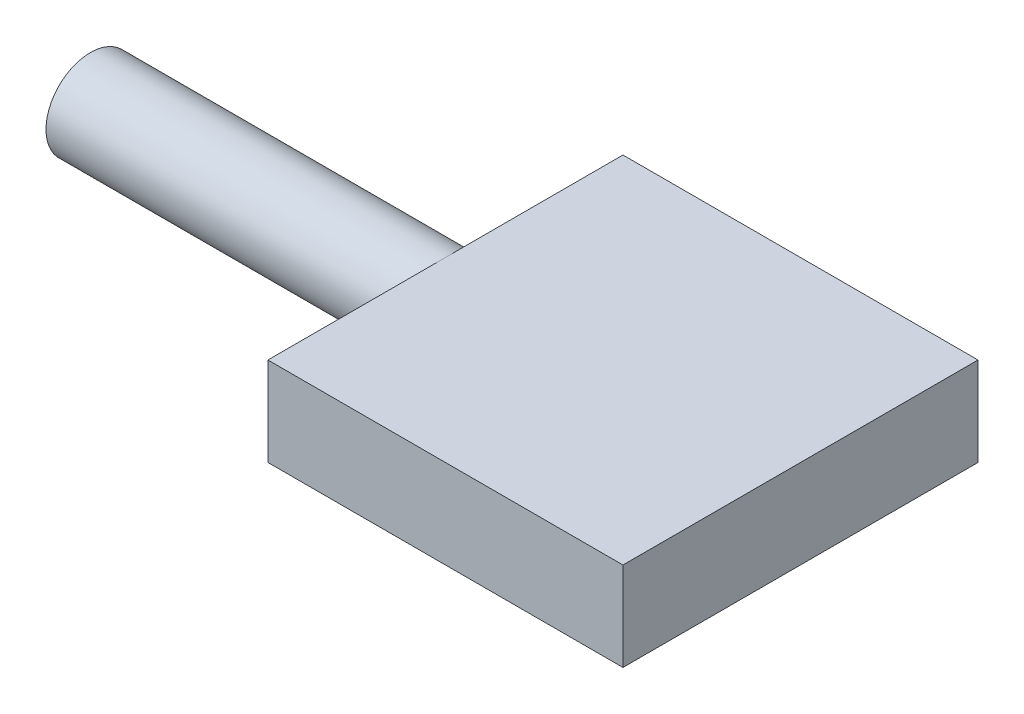
ISO-10303-21;
HEADER;
FILE_DESCRIPTION(('STEP AP214'),'2;1');
FILE_NAME('part.step','',(''),(''),'','','');
FILE_SCHEMA(('AUTOMOTIVE_DESIGN { 1 0 10303 214 1 1 1 1 }'));
ENDSEC;
DATA;
#1=APPLICATION_CONTEXT('core data for automotive mechanical design processes');
#2=APPLICATION_PROTOCOL_DEFINITION('international standard','automotive_design',2000,#1);
#3=PRODUCT_CONTEXT('',#1,'mechanical');
#4=PRODUCT('Part','Part','',(#3));
#5=PRODUCT_RELATED_PRODUCT_CATEGORY('part','',(#4));
#6=PRODUCT_DEFINITION_FORMATION('','',#4);
#7=PRODUCT_DEFINITION_CONTEXT('part definition',#1,'design');
#8=PRODUCT_DEFINITION('design','',#6,#7);
#9=PRODUCT_DEFINITION_SHAPE('','',#8);
#10=(LENGTH_UNIT() NAMED_UNIT(*) SI_UNIT(.MILLI.,.METRE.));
#11=(NAMED_UNIT(*) PLANE_ANGLE_UNIT() SI_UNIT($,.RADIAN.));
#12=(NAMED_UNIT(*) SI_UNIT($,.STERADIAN.) SOLID_ANGLE_UNIT());
#13=UNCERTAINTY_MEASURE_WITH_UNIT(LENGTH_MEASURE(1.E-05),#10,'distance_accuracy_value','');
#14=(GEOMETRIC_REPRESENTATION_CONTEXT(3) GLOBAL_UNCERTAINTY_ASSIGNED_CONTEXT((#13)) GLOBAL_UNIT_ASSIGNED_CONTEXT((#10,
#11,#12)) REPRESENTATION_CONTEXT('',''));
#15=CARTESIAN_POINT('',(0.,0.,0.));
#16=DIRECTION('',(0.,0.,1.));
#17=DIRECTION('',(1.,0.,0.));
#18=AXIS2_PLACEMENT_3D('',#15,#16,#17);
#19=CARTESIAN_POINT('',(0.,10.,0.));
#20=DIRECTION('',(1.,0.,0.));
#21=DIRECTION('',(0.,0.,-1.));
#22=AXIS2_PLACEMENT_3D('',#19,#20,#21);
#23=PLANE('',#22);
#24=CARTESIAN_POINT('',(0.,5.,-20.));
#25=DIRECTION('',(-1.,0.,0.));
#26=DIRECTION('',(0.,0.,1.));
#27=AXIS2_PLACEMENT_3D('',#24,#25,#26);
#28=CIRCLE('',#27,5.);
#29=CARTESIAN_POINT('',(0.,10.,-20.));
#30=VERTEX_POINT('',#29);
#31=CARTESIAN_POINT('',(0.,0.,-20.));
#32=VERTEX_POINT('',#31);
#33=EDGE_CURVE('E42',#30,#32,#28,.T.);
#34=ORIENTED_EDGE('',*,*,#33,.F.);
#35=DIRECTION('',(0.,0.,1.));
#36=VECTOR('',#35,1.);
#37=CARTESIAN_POINT('',(0.,10.,0.));
#38=LINE('',#37,#36);
#39=CARTESIAN_POINT('',(0.,10.,-40.));
#40=VERTEX_POINT('',#39);
#41=EDGE_CURVE('E85',#40,#30,#38,.T.);
#42=ORIENTED_EDGE('',*,*,#41,.F.);
#43=DIRECTION('',(0.,-1.,0.));
#44=VECTOR('',#43,1.);
#45=CARTESIAN_POINT('',(0.,10.,-40.));
#46=LINE('',#45,#44);
#47=CARTESIAN_POINT('',(0.,0.,-40.));
#48=VERTEX_POINT('',#47);
#49=EDGE_CURVE('E196',#40,#48,#46,.T.);
#50=ORIENTED_EDGE('',*,*,#49,.T.);
#51=DIRECTION('',(0.,0.,1.));
#52=VECTOR('',#51,1.);
#53=CARTESIAN_POINT('',(0.,0.,0.));
#54=LINE('',#53,#52);
#55=EDGE_CURVE('E96',#48,#32,#54,.T.);
#56=ORIENTED_EDGE('',*,*,#55,.T.);
#57=EDGE_LOOP('',(#34,#42,#50,#56));
#58=FACE_BOUND('',#57,.T.);
#59=ADVANCED_FACE('F32',(#58),#23,.F.);
#60=EDGE_CURVE('E11',#32,#30,#28,.T.);
#61=ORIENTED_EDGE('',*,*,#60,.F.);
#62=CARTESIAN_POINT('',(0.,0.,0.));
#63=VERTEX_POINT('',#62);
#64=EDGE_CURVE('E201',#32,#63,#54,.T.);
#65=ORIENTED_EDGE('',*,*,#64,.T.);
#66=DIRECTION('',(0.,-1.,0.));
#67=VECTOR('',#66,1.);
#68=CARTESIAN_POINT('',(0.,10.,0.));
#69=LINE('',#68,#67);
#70=CARTESIAN_POINT('',(0.,10.,0.));
#71=VERTEX_POINT('',#70);
#72=EDGE_CURVE('E36',#71,#63,#69,.T.);
#73=ORIENTED_EDGE('',*,*,#72,.F.);
#74=EDGE_CURVE('E81',#30,#71,#38,.T.);
#75=ORIENTED_EDGE('',*,*,#74,.F.);
#76=EDGE_LOOP('',(#61,#65,#73,#75));
#77=FACE_BOUND('',#76,.T.);
#78=ADVANCED_FACE('F34',(#77),#23,.F.);
#79=CARTESIAN_POINT('',(0.,10.,0.));
#80=DIRECTION('',(0.,0.,-1.));
#81=DIRECTION('',(-1.,0.,0.));
#82=AXIS2_PLACEMENT_3D('',#79,#80,#81);
#83=PLANE('',#82);
#84=DIRECTION('',(1.,0.,0.));
#85=VECTOR('',#84,1.);
#86=CARTESIAN_POINT('',(0.,0.,0.));
#87=LINE('',#86,#85);
#88=CARTESIAN_POINT('',(40.,0.,0.));
#89=VERTEX_POINT('',#88);
#90=EDGE_CURVE('E182',#63,#89,#87,.T.);
#91=ORIENTED_EDGE('',*,*,#90,.T.);
#92=DIRECTION('',(0.,-1.,0.));
#93=VECTOR('',#92,1.);
#94=CARTESIAN_POINT('',(40.,10.,0.));
#95=LINE('',#94,#93);
#96=CARTESIAN_POINT('',(40.,10.,0.));
#97=VERTEX_POINT('',#96);
#98=EDGE_CURVE('E184',#97,#89,#95,.T.);
#99=ORIENTED_EDGE('',*,*,#98,.F.);
#100=DIRECTION('',(1.,0.,0.));
#101=VECTOR('',#100,1.);
#102=CARTESIAN_POINT('',(0.,10.,0.));
#103=LINE('',#102,#101);
#104=EDGE_CURVE('E89',#71,#97,#103,.T.);
#105=ORIENTED_EDGE('',*,*,#104,.F.);
#106=ORIENTED_EDGE('',*,*,#72,.T.);
#107=EDGE_LOOP('',(#91,#99,#105,#106));
#108=FACE_BOUND('',#107,.T.);
#109=ADVANCED_FACE('F119',(#108),#83,.F.);
#110=CARTESIAN_POINT('',(40.,10.,0.));
#111=DIRECTION('',(-1.,0.,0.));
#112=DIRECTION('',(0.,0.,1.));
#113=AXIS2_PLACEMENT_3D('',#110,#111,#112);
#114=PLANE('',#113);
#115=DIRECTION('',(0.,0.,-1.));
#116=VECTOR('',#115,1.);
#117=CARTESIAN_POINT('',(40.,0.,0.));
#118=LINE('',#117,#116);
#119=CARTESIAN_POINT('',(40.,0.,-40.));
#120=VERTEX_POINT('',#119);
#121=EDGE_CURVE('E187',#89,#120,#118,.T.);
#122=ORIENTED_EDGE('',*,*,#121,.T.);
#123=DIRECTION('',(0.,-1.,0.));
#124=VECTOR('',#123,1.);
#125=CARTESIAN_POINT('',(40.,10.,-40.));
#126=LINE('',#125,#124);
#127=CARTESIAN_POINT('',(40.,10.,-40.));
#128=VERTEX_POINT('',#127);
#129=EDGE_CURVE('E191',#128,#120,#126,.T.);
#130=ORIENTED_EDGE('',*,*,#129,.F.);
#131=DIRECTION('',(0.,0.,-1.));
#132=VECTOR('',#131,1.);
#133=CARTESIAN_POINT('',(40.,10.,0.));
#134=LINE('',#133,#132);
#135=EDGE_CURVE('E190',#97,#128,#134,.T.);
#136=ORIENTED_EDGE('',*,*,#135,.F.);
#137=ORIENTED_EDGE('',*,*,#98,.T.);
#138=EDGE_LOOP('',(#122,#130,#136,#137));
#139=FACE_BOUND('',#138,.T.);
#140=ADVANCED_FACE('F123',(#139),#114,.F.);
#141=CARTESIAN_POINT('',(0.,10.,-40.));
#142=DIRECTION('',(0.,0.,1.));
#143=DIRECTION('',(1.,0.,0.));
#144=AXIS2_PLACEMENT_3D('',#141,#142,#143);
#145=PLANE('',#144);
#146=DIRECTION('',(-1.,0.,0.));
#147=VECTOR('',#146,1.);
#148=CARTESIAN_POINT('',(0.,0.,-40.));
#149=LINE('',#148,#147);
#150=EDGE_CURVE('E76',#120,#48,#149,.T.);
#151=ORIENTED_EDGE('',*,*,#150,.T.);
#152=ORIENTED_EDGE('',*,*,#49,.F.);
#153=DIRECTION('',(-1.,0.,0.));
#154=VECTOR('',#153,1.);
#155=CARTESIAN_POINT('',(0.,10.,-40.));
#156=LINE('',#155,#154);
#157=EDGE_CURVE('E56',#128,#40,#156,.T.);
#158=ORIENTED_EDGE('',*,*,#157,.F.);
#159=ORIENTED_EDGE('',*,*,#129,.T.);
#160=EDGE_LOOP('',(#151,#152,#158,#159));
#161=FACE_BOUND('',#160,.T.);
#162=ADVANCED_FACE('F128',(#161),#145,.F.);
#163=CARTESIAN_POINT('',(0.,10.,0.));
#164=DIRECTION('',(0.,-1.,0.));
#165=DIRECTION('',(0.,0.,-1.));
#166=AXIS2_PLACEMENT_3D('',#163,#164,#165);
#167=PLANE('',#166);
#168=ORIENTED_EDGE('',*,*,#41,.T.);
#169=ORIENTED_EDGE('',*,*,#74,.T.);
#170=ORIENTED_EDGE('',*,*,#104,.T.);
#171=ORIENTED_EDGE('',*,*,#135,.T.);
#172=ORIENTED_EDGE('',*,*,#157,.T.);
#173=EDGE_LOOP('',(#168,#169,#170,#171,#172));
#174=FACE_BOUND('',#173,.T.);
#175=ADVANCED_FACE('F86',(#174),#167,.F.);
#176=CARTESIAN_POINT('',(0.,0.,0.));
#177=DIRECTION('',(0.,-1.,0.));
#178=DIRECTION('',(0.,0.,-1.));
#179=AXIS2_PLACEMENT_3D('',#176,#177,#178);
#180=PLANE('',#179);
#181=ORIENTED_EDGE('',*,*,#55,.F.);
#182=ORIENTED_EDGE('',*,*,#150,.F.);
#183=ORIENTED_EDGE('',*,*,#121,.F.);
#184=ORIENTED_EDGE('',*,*,#90,.F.);
#185=ORIENTED_EDGE('',*,*,#64,.F.);
#186=EDGE_LOOP('',(#181,#182,#183,#184,#185));
#187=FACE_BOUND('',#186,.T.);
#188=ADVANCED_FACE('F102',(#187),#180,.T.);
#189=CARTESIAN_POINT('',(-40.,5.,-20.));
#190=DIRECTION('',(1.,0.,0.));
#191=DIRECTION('',(0.,0.,-1.));
#192=AXIS2_PLACEMENT_3D('',#189,#190,#191);
#193=CYLINDRICAL_SURFACE('',#192,5.);
#194=CARTESIAN_POINT('',(-40.,5.,-20.));
#195=DIRECTION('',(-1.,0.,0.));
#196=DIRECTION('',(0.,0.,1.));
#197=AXIS2_PLACEMENT_3D('',#194,#195,#196);
#198=CIRCLE('',#197,5.);
#199=CARTESIAN_POINT('',(-40.,5.,-15.));
#200=VERTEX_POINT('',#199);
#201=EDGE_CURVE('E98',#200,#200,#198,.T.);
#202=ORIENTED_EDGE('',*,*,#201,.F.);
#203=EDGE_LOOP('',(#202));
#204=FACE_BOUND('',#203,.T.);
#205=ORIENTED_EDGE('',*,*,#33,.T.);
#206=ORIENTED_EDGE('',*,*,#60,.T.);
#207=EDGE_LOOP('',(#205,#206));
#208=FACE_BOUND('',#207,.T.);
#209=ADVANCED_FACE('F99',(#204,#208),#193,.T.);
#210=CARTESIAN_POINT('',(-40.,5.,-20.));
#211=DIRECTION('',(-1.,0.,0.));
#212=DIRECTION('',(0.,0.,1.));
#213=AXIS2_PLACEMENT_3D('',#210,#211,#212);
#214=PLANE('',#213);
#215=ORIENTED_EDGE('',*,*,#201,.T.);
#216=EDGE_LOOP('',(#215));
#217=FACE_BOUND('',#216,.T.);
#218=ADVANCED_FACE('F101',(#217),#214,.T.);
#219=CLOSED_SHELL('',(#59,#78,#109,#140,#162,#175,#188,#209,#218));
#220=MANIFOLD_SOLID_BREP('B2',#219);
#221=ADVANCED_BREP_SHAPE_REPRESENTATION('',(#18,#220),#14);
#222=SHAPE_DEFINITION_REPRESENTATION(#9,#221);
ENDSEC;
END-ISO-10303-21;
